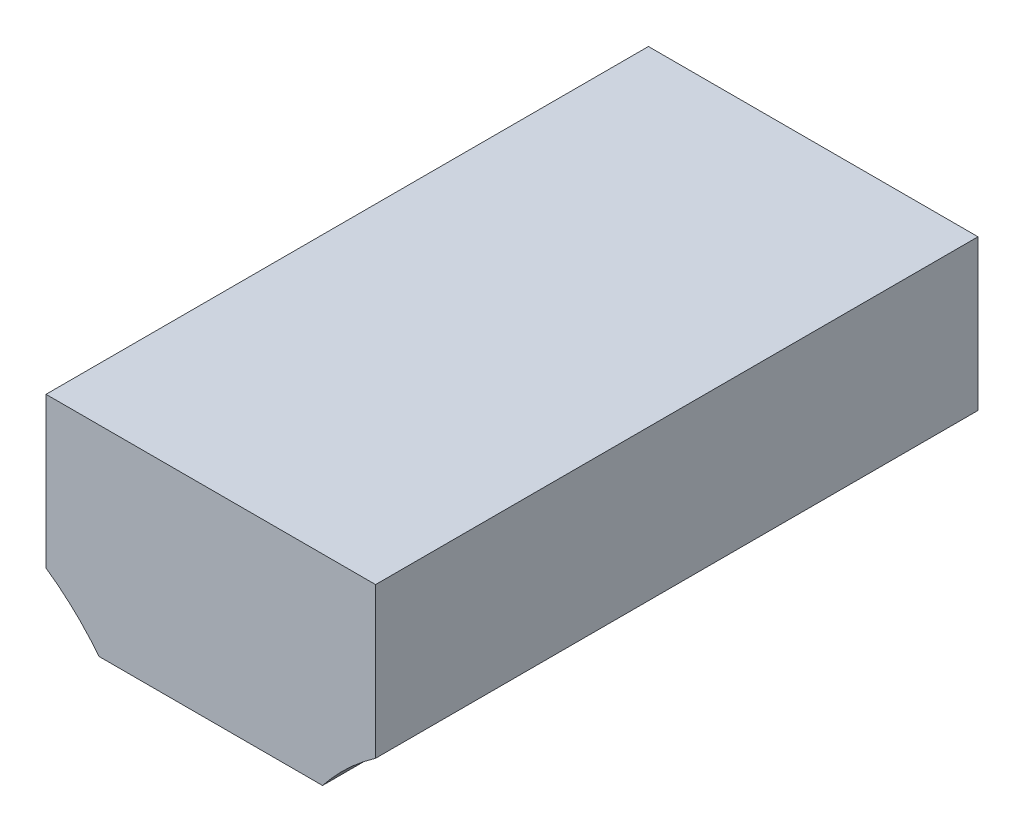
ISO-10303-21;
HEADER;
FILE_DESCRIPTION(('STEP AP214'),'2;1');
FILE_NAME('part.step','',(''),(''),'','','');
FILE_SCHEMA(('AUTOMOTIVE_DESIGN { 1 0 10303 214 1 1 1 1 }'));
ENDSEC;
DATA;
#1=APPLICATION_CONTEXT('core data for automotive mechanical design processes');
#2=APPLICATION_PROTOCOL_DEFINITION('international standard','automotive_design',2000,#1);
#3=PRODUCT_CONTEXT('',#1,'mechanical');
#4=PRODUCT('Part','Part','',(#3));
#5=PRODUCT_RELATED_PRODUCT_CATEGORY('part','',(#4));
#6=PRODUCT_DEFINITION_FORMATION('','',#4);
#7=PRODUCT_DEFINITION_CONTEXT('part definition',#1,'design');
#8=PRODUCT_DEFINITION('design','',#6,#7);
#9=PRODUCT_DEFINITION_SHAPE('','',#8);
#10=(LENGTH_UNIT() NAMED_UNIT(*) SI_UNIT(.MILLI.,.METRE.));
#11=(NAMED_UNIT(*) PLANE_ANGLE_UNIT() SI_UNIT($,.RADIAN.));
#12=(NAMED_UNIT(*) SI_UNIT($,.STERADIAN.) SOLID_ANGLE_UNIT());
#13=UNCERTAINTY_MEASURE_WITH_UNIT(LENGTH_MEASURE(1.E-05),#10,'distance_accuracy_value','');
#14=(GEOMETRIC_REPRESENTATION_CONTEXT(3) GLOBAL_UNCERTAINTY_ASSIGNED_CONTEXT((#13)) GLOBAL_UNIT_ASSIGNED_CONTEXT((#10,
#11,#12)) REPRESENTATION_CONTEXT('',''));
#15=CARTESIAN_POINT('',(0.,0.,0.));
#16=DIRECTION('',(0.,0.,1.));
#17=DIRECTION('',(1.,0.,0.));
#18=AXIS2_PLACEMENT_3D('',#15,#16,#17);
#19=CARTESIAN_POINT('',(20.4149458209838,-17.5719864981946,55.6565631997072));
#20=DIRECTION('',(0.,0.,-1.));
#21=DIRECTION('',(-1.,0.,0.));
#22=AXIS2_PLACEMENT_3D('',#19,#20,#21);
#23=CYLINDRICAL_SURFACE('',#22,16.5184729061785);
#24=DIRECTION('',(0.,0.,-1.));
#25=VECTOR('',#24,1.);
#26=CARTESIAN_POINT('',(10.9589663451972,-4.02782172861005,55.6565631997072));
#27=LINE('',#26,#25);
#28=CARTESIAN_POINT('',(10.9589663451972,-4.02782172861005,29.9999999998664));
#29=VERTEX_POINT('',#28);
#30=CARTESIAN_POINT('',(10.9589663451972,-4.02782172861005,-10.0645130324685));
#31=VERTEX_POINT('',#30);
#32=EDGE_CURVE('E121',#29,#31,#27,.T.);
#33=ORIENTED_EDGE('',*,*,#32,.F.);
#34=CARTESIAN_POINT('',(20.4149458209838,-17.5719864981946,29.9999999998664));
#35=DIRECTION('',(0.,0.,1.));
#36=DIRECTION('',(1.,0.,0.));
#37=AXIS2_PLACEMENT_3D('',#34,#35,#36);
#38=CIRCLE('',#37,16.5184729061785);
#39=CARTESIAN_POINT('',(7.43223850343709,-7.35879611227343,29.9999999998664));
#40=VERTEX_POINT('',#39);
#41=EDGE_CURVE('E41',#29,#40,#38,.T.);
#42=ORIENTED_EDGE('',*,*,#41,.T.);
#43=DIRECTION('',(0.,0.,-1.));
#44=VECTOR('',#43,1.);
#45=CARTESIAN_POINT('',(7.43223850343709,-7.35879611227343,55.6565631997072));
#46=LINE('',#45,#44);
#47=CARTESIAN_POINT('',(7.43223850343709,-7.35879611227343,-10.0645130324685));
#48=VERTEX_POINT('',#47);
#49=EDGE_CURVE('E84',#40,#48,#46,.T.);
#50=ORIENTED_EDGE('',*,*,#49,.T.);
#51=CARTESIAN_POINT('',(20.4149458209838,-17.5719864981946,-10.0645130324685));
#52=DIRECTION('',(0.,0.,1.));
#53=DIRECTION('',(1.,0.,0.));
#54=AXIS2_PLACEMENT_3D('',#51,#52,#53);
#55=CIRCLE('',#54,16.5184729061785);
#56=EDGE_CURVE('E88',#31,#48,#55,.T.);
#57=ORIENTED_EDGE('',*,*,#56,.F.);
#58=EDGE_LOOP('',(#33,#42,#50,#57));
#59=FACE_BOUND('',#58,.T.);
#60=ADVANCED_FACE('F33',(#59),#23,.F.);
#61=CARTESIAN_POINT('',(10.9589663451972,-61.5799494290821,55.6565631997072));
#62=DIRECTION('',(-1.,0.,0.));
#63=DIRECTION('',(0.,0.,1.));
#64=AXIS2_PLACEMENT_3D('',#61,#62,#63);
#65=PLANE('',#64);
#66=DIRECTION('',(0.,1.,0.));
#67=VECTOR('',#66,1.);
#68=CARTESIAN_POINT('',(10.9589663451972,-61.5799494290821,29.9999999998664));
#69=LINE('',#68,#67);
#70=CARTESIAN_POINT('',(10.9589663451972,5.97774998507759,29.9999999998664));
#71=VERTEX_POINT('',#70);
#72=EDGE_CURVE('E60',#29,#71,#69,.T.);
#73=ORIENTED_EDGE('',*,*,#72,.F.);
#74=ORIENTED_EDGE('',*,*,#32,.T.);
#75=DIRECTION('',(0.,1.,0.));
#76=VECTOR('',#75,1.);
#77=CARTESIAN_POINT('',(10.9589663451972,-61.5799494290821,-10.0645130324685));
#78=LINE('',#77,#76);
#79=CARTESIAN_POINT('',(10.9589663451972,5.97774998507759,-10.0645130324685));
#80=VERTEX_POINT('',#79);
#81=EDGE_CURVE('E91',#31,#80,#78,.T.);
#82=ORIENTED_EDGE('',*,*,#81,.T.);
#83=DIRECTION('',(0.,0.,-1.));
#84=VECTOR('',#83,1.);
#85=CARTESIAN_POINT('',(10.9589663451972,5.97774998507759,55.6565631997072));
#86=LINE('',#85,#84);
#87=EDGE_CURVE('E124',#71,#80,#86,.T.);
#88=ORIENTED_EDGE('',*,*,#87,.F.);
#89=EDGE_LOOP('',(#73,#74,#82,#88));
#90=FACE_BOUND('',#89,.T.);
#91=ADVANCED_FACE('F142',(#90),#65,.F.);
#92=CARTESIAN_POINT('',(-42.54278865992,5.97774998507759,55.6565631997072));
#93=DIRECTION('',(0.,-1.,0.));
#94=DIRECTION('',(0.,0.,-1.));
#95=AXIS2_PLACEMENT_3D('',#92,#93,#94);
#96=PLANE('',#95);
#97=DIRECTION('',(-1.,0.,0.));
#98=VECTOR('',#97,1.);
#99=CARTESIAN_POINT('',(-42.54278865992,5.97774998507759,29.9999999998664));
#100=LINE('',#99,#98);
#101=CARTESIAN_POINT('',(-10.9589663451972,5.97774998507759,29.9999999998664));
#102=VERTEX_POINT('',#101);
#103=EDGE_CURVE('E56',#71,#102,#100,.T.);
#104=ORIENTED_EDGE('',*,*,#103,.F.);
#105=ORIENTED_EDGE('',*,*,#87,.T.);
#106=DIRECTION('',(-1.,0.,0.));
#107=VECTOR('',#106,1.);
#108=CARTESIAN_POINT('',(-42.54278865992,5.97774998507759,-10.0645130324685));
#109=LINE('',#108,#107);
#110=CARTESIAN_POINT('',(-10.9589663451972,5.97774998507759,-10.0645130324685));
#111=VERTEX_POINT('',#110);
#112=EDGE_CURVE('E117',#80,#111,#109,.T.);
#113=ORIENTED_EDGE('',*,*,#112,.T.);
#114=DIRECTION('',(0.,0.,-1.));
#115=VECTOR('',#114,1.);
#116=CARTESIAN_POINT('',(-10.9589663451972,5.97774998507759,55.6565631997072));
#117=LINE('',#116,#115);
#118=EDGE_CURVE('E126',#102,#111,#117,.T.);
#119=ORIENTED_EDGE('',*,*,#118,.F.);
#120=EDGE_LOOP('',(#104,#105,#113,#119));
#121=FACE_BOUND('',#120,.T.);
#122=ADVANCED_FACE('F139',(#121),#96,.F.);
#123=CARTESIAN_POINT('',(-10.9589663451972,-61.5799494290821,55.6565631997072));
#124=DIRECTION('',(1.,0.,0.));
#125=DIRECTION('',(0.,0.,-1.));
#126=AXIS2_PLACEMENT_3D('',#123,#124,#125);
#127=PLANE('',#126);
#128=DIRECTION('',(0.,-1.,0.));
#129=VECTOR('',#128,1.);
#130=CARTESIAN_POINT('',(-10.9589663451972,-61.5799494290821,29.9999999998664));
#131=LINE('',#130,#129);
#132=CARTESIAN_POINT('',(-10.9589663451972,-4.02782172861005,29.9999999998664));
#133=VERTEX_POINT('',#132);
#134=EDGE_CURVE('E143',#102,#133,#131,.T.);
#135=ORIENTED_EDGE('',*,*,#134,.F.);
#136=ORIENTED_EDGE('',*,*,#118,.T.);
#137=DIRECTION('',(0.,-1.,0.));
#138=VECTOR('',#137,1.);
#139=CARTESIAN_POINT('',(-10.9589663451972,-61.5799494290821,-10.0645130324685));
#140=LINE('',#139,#138);
#141=CARTESIAN_POINT('',(-10.9589663451972,-4.02782172861005,-10.0645130324685));
#142=VERTEX_POINT('',#141);
#143=EDGE_CURVE('E114',#111,#142,#140,.T.);
#144=ORIENTED_EDGE('',*,*,#143,.T.);
#145=DIRECTION('',(0.,0.,-1.));
#146=VECTOR('',#145,1.);
#147=CARTESIAN_POINT('',(-10.9589663451972,-4.02782172861005,55.6565631997072));
#148=LINE('',#147,#146);
#149=EDGE_CURVE('E128',#133,#142,#148,.T.);
#150=ORIENTED_EDGE('',*,*,#149,.F.);
#151=EDGE_LOOP('',(#135,#136,#144,#150));
#152=FACE_BOUND('',#151,.T.);
#153=ADVANCED_FACE('F136',(#152),#127,.F.);
#154=CARTESIAN_POINT('',(-20.4149458209838,-17.5719864981946,55.6565631997072));
#155=DIRECTION('',(0.,0.,-1.));
#156=DIRECTION('',(-1.,0.,0.));
#157=AXIS2_PLACEMENT_3D('',#154,#155,#156);
#158=CYLINDRICAL_SURFACE('',#157,16.5184729061785);
#159=DIRECTION('',(0.,0.,-1.));
#160=VECTOR('',#159,1.);
#161=CARTESIAN_POINT('',(-7.4322385034371,-7.35879611227343,55.6565631997072));
#162=LINE('',#161,#160);
#163=CARTESIAN_POINT('',(-7.4322385034371,-7.35879611227343,29.9999999998664));
#164=VERTEX_POINT('',#163);
#165=CARTESIAN_POINT('',(-7.4322385034371,-7.35879611227343,-10.0645130324685));
#166=VERTEX_POINT('',#165);
#167=EDGE_CURVE('E90',#164,#166,#162,.T.);
#168=ORIENTED_EDGE('',*,*,#167,.F.);
#169=CARTESIAN_POINT('',(-20.4149458209838,-17.5719864981946,29.9999999998664));
#170=DIRECTION('',(0.,0.,1.));
#171=DIRECTION('',(1.,0.,0.));
#172=AXIS2_PLACEMENT_3D('',#169,#170,#171);
#173=CIRCLE('',#172,16.5184729061785);
#174=EDGE_CURVE('E123',#164,#133,#173,.T.);
#175=ORIENTED_EDGE('',*,*,#174,.T.);
#176=ORIENTED_EDGE('',*,*,#149,.T.);
#177=CARTESIAN_POINT('',(-20.4149458209838,-17.5719864981946,-10.0645130324685));
#178=DIRECTION('',(0.,0.,1.));
#179=DIRECTION('',(1.,0.,0.));
#180=AXIS2_PLACEMENT_3D('',#177,#178,#179);
#181=CIRCLE('',#180,16.5184729061785);
#182=EDGE_CURVE('E99',#166,#142,#181,.T.);
#183=ORIENTED_EDGE('',*,*,#182,.F.);
#184=EDGE_LOOP('',(#168,#175,#176,#183));
#185=FACE_BOUND('',#184,.T.);
#186=ADVANCED_FACE('F133',(#185),#158,.F.);
#187=CARTESIAN_POINT('',(-42.54278865992,-7.35879611227343,55.6565631997072));
#188=DIRECTION('',(0.,1.,0.));
#189=DIRECTION('',(0.,0.,1.));
#190=AXIS2_PLACEMENT_3D('',#187,#188,#189);
#191=PLANE('',#190);
#192=CARTESIAN_POINT('',(0.,-7.35879611227343,9.96774348487686));
#193=DIRECTION('',(0.,-1.,0.));
#194=DIRECTION('',(0.,0.,-1.));
#195=AXIS2_PLACEMENT_3D('',#192,#193,#194);
#196=CIRCLE('',#195,5.49999999935034);
#197=CARTESIAN_POINT('',(0.,-7.35879611227343,4.46774348552651));
#198=VERTEX_POINT('',#197);
#199=EDGE_CURVE('E108',#198,#198,#196,.T.);
#200=ORIENTED_EDGE('',*,*,#199,.F.);
#201=EDGE_LOOP('',(#200));
#202=FACE_BOUND('',#201,.T.);
#203=DIRECTION('',(1.,0.,0.));
#204=VECTOR('',#203,1.);
#205=CARTESIAN_POINT('',(-42.54278865992,-7.35879611227343,29.9999999998664));
#206=LINE('',#205,#204);
#207=EDGE_CURVE('E11',#164,#40,#206,.T.);
#208=ORIENTED_EDGE('',*,*,#207,.F.);
#209=ORIENTED_EDGE('',*,*,#167,.T.);
#210=DIRECTION('',(1.,0.,0.));
#211=VECTOR('',#210,1.);
#212=CARTESIAN_POINT('',(-42.54278865992,-7.35879611227343,-10.0645130324685));
#213=LINE('',#212,#211);
#214=EDGE_CURVE('E93',#166,#48,#213,.T.);
#215=ORIENTED_EDGE('',*,*,#214,.T.);
#216=ORIENTED_EDGE('',*,*,#49,.F.);
#217=EDGE_LOOP('',(#208,#209,#215,#216));
#218=FACE_BOUND('',#217,.T.);
#219=ADVANCED_FACE('F94',(#202,#218),#191,.F.);
#220=CARTESIAN_POINT('',(20.4149458209838,-17.5719864981946,-10.0645130324685));
#221=DIRECTION('',(0.,0.,1.));
#222=DIRECTION('',(1.,0.,0.));
#223=AXIS2_PLACEMENT_3D('',#220,#221,#222);
#224=PLANE('',#223);
#225=ORIENTED_EDGE('',*,*,#56,.T.);
#226=ORIENTED_EDGE('',*,*,#214,.F.);
#227=ORIENTED_EDGE('',*,*,#182,.T.);
#228=ORIENTED_EDGE('',*,*,#143,.F.);
#229=ORIENTED_EDGE('',*,*,#112,.F.);
#230=ORIENTED_EDGE('',*,*,#81,.F.);
#231=EDGE_LOOP('',(#225,#226,#227,#228,#229,#230));
#232=FACE_BOUND('',#231,.T.);
#233=ADVANCED_FACE('F102',(#232),#224,.F.);
#234=CARTESIAN_POINT('',(-42.5366491356155,-61.6509215057815,29.9999999998664));
#235=DIRECTION('',(0.,0.,1.));
#236=DIRECTION('',(1.,0.,0.));
#237=AXIS2_PLACEMENT_3D('',#234,#235,#236);
#238=PLANE('',#237);
#239=ORIENTED_EDGE('',*,*,#72,.T.);
#240=ORIENTED_EDGE('',*,*,#103,.T.);
#241=ORIENTED_EDGE('',*,*,#134,.T.);
#242=ORIENTED_EDGE('',*,*,#174,.F.);
#243=ORIENTED_EDGE('',*,*,#207,.T.);
#244=ORIENTED_EDGE('',*,*,#41,.F.);
#245=EDGE_LOOP('',(#239,#240,#241,#242,#243,#244));
#246=FACE_BOUND('',#245,.T.);
#247=ADVANCED_FACE('F174',(#246),#238,.T.);
#248=CARTESIAN_POINT('',(0.,-1.85879611227343,9.96774348487686));
#249=DIRECTION('',(0.,-1.,0.));
#250=DIRECTION('',(0.,0.,-1.));
#251=AXIS2_PLACEMENT_3D('',#248,#249,#250);
#252=CYLINDRICAL_SURFACE('',#251,5.49999999935034);
#253=CARTESIAN_POINT('',(0.,-1.85879611227343,9.96774348487686));
#254=DIRECTION('',(0.,-1.,0.));
#255=DIRECTION('',(0.,0.,-1.));
#256=AXIS2_PLACEMENT_3D('',#253,#254,#255);
#257=CIRCLE('',#256,5.49999999935034);
#258=CARTESIAN_POINT('',(0.,-1.85879611227343,4.46774348552651));
#259=VERTEX_POINT('',#258);
#260=EDGE_CURVE('E105',#259,#259,#257,.T.);
#261=ORIENTED_EDGE('',*,*,#260,.F.);
#262=EDGE_LOOP('',(#261));
#263=FACE_BOUND('',#262,.T.);
#264=ORIENTED_EDGE('',*,*,#199,.T.);
#265=EDGE_LOOP('',(#264));
#266=FACE_BOUND('',#265,.T.);
#267=ADVANCED_FACE('F168',(#263,#266),#252,.F.);
#268=CARTESIAN_POINT('',(0.,-1.85879611227343,9.96774348487686));
#269=DIRECTION('',(0.,-1.,0.));
#270=DIRECTION('',(0.,0.,-1.));
#271=AXIS2_PLACEMENT_3D('',#268,#269,#270);
#272=PLANE('',#271);
#273=CARTESIAN_POINT('',(0.,-1.85879611227343,9.96774348487686));
#274=DIRECTION('',(0.,-1.,0.));
#275=DIRECTION('',(0.,0.,-1.));
#276=AXIS2_PLACEMENT_3D('',#273,#274,#275);
#277=CIRCLE('',#276,1.99999999935034);
#278=CARTESIAN_POINT('',(0.,-1.85879611227343,7.96774348552651));
#279=VERTEX_POINT('',#278);
#280=EDGE_CURVE('E151',#279,#279,#277,.T.);
#281=ORIENTED_EDGE('',*,*,#280,.F.);
#282=EDGE_LOOP('',(#281));
#283=FACE_BOUND('',#282,.T.);
#284=ORIENTED_EDGE('',*,*,#260,.T.);
#285=EDGE_LOOP('',(#284));
#286=FACE_BOUND('',#285,.T.);
#287=ADVANCED_FACE('F162',(#283,#286),#272,.T.);
#288=CARTESIAN_POINT('',(0.,2.14120388772657,9.96774348487686));
#289=DIRECTION('',(0.,-1.,0.));
#290=DIRECTION('',(0.,0.,-1.));
#291=AXIS2_PLACEMENT_3D('',#288,#289,#290);
#292=CYLINDRICAL_SURFACE('',#291,1.99999999935034);
#293=CARTESIAN_POINT('',(0.,2.14120388772657,9.96774348487686));
#294=DIRECTION('',(0.,-1.,0.));
#295=DIRECTION('',(0.,0.,-1.));
#296=AXIS2_PLACEMENT_3D('',#293,#294,#295);
#297=CIRCLE('',#296,1.99999999935034);
#298=CARTESIAN_POINT('',(0.,2.14120388772657,7.96774348552651));
#299=VERTEX_POINT('',#298);
#300=EDGE_CURVE('E149',#299,#299,#297,.T.);
#301=ORIENTED_EDGE('',*,*,#300,.F.);
#302=EDGE_LOOP('',(#301));
#303=FACE_BOUND('',#302,.T.);
#304=ORIENTED_EDGE('',*,*,#280,.T.);
#305=EDGE_LOOP('',(#304));
#306=FACE_BOUND('',#305,.T.);
#307=ADVANCED_FACE('F159',(#303,#306),#292,.F.);
#308=CARTESIAN_POINT('',(0.,2.14120388772657,9.96774348487686));
#309=DIRECTION('',(0.,-1.,0.));
#310=DIRECTION('',(0.,0.,-1.));
#311=AXIS2_PLACEMENT_3D('',#308,#309,#310);
#312=PLANE('',#311);
#313=ORIENTED_EDGE('',*,*,#300,.T.);
#314=EDGE_LOOP('',(#313));
#315=FACE_BOUND('',#314,.T.);
#316=ADVANCED_FACE('F157',(#315),#312,.T.);
#317=CLOSED_SHELL('',(#60,#91,#122,#153,#186,#219,#233,#247,#267,#287,#307,#316));
#318=MANIFOLD_SOLID_BREP('B2',#317);
#319=ADVANCED_BREP_SHAPE_REPRESENTATION('',(#18,#318),#14);
#320=SHAPE_DEFINITION_REPRESENTATION(#9,#319);
ENDSEC;
END-ISO-10303-21;
